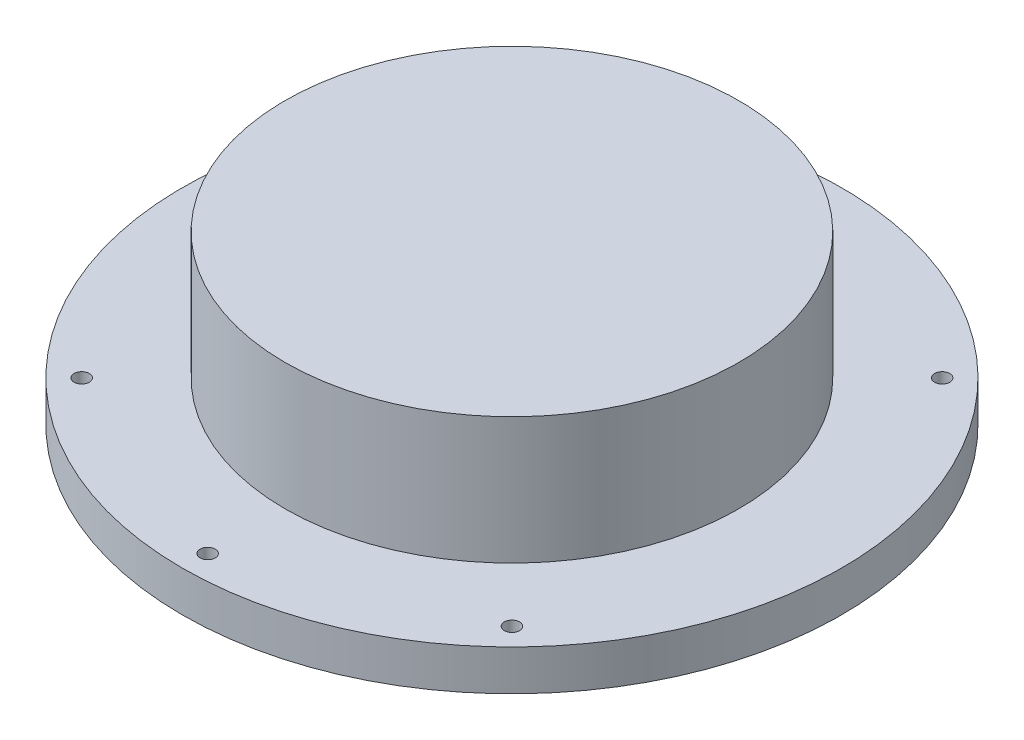
ISO-10303-21;
HEADER;
FILE_DESCRIPTION(('STEP AP214'),'2;1');
FILE_NAME('part.step','',(''),(''),'','','');
FILE_SCHEMA(('AUTOMOTIVE_DESIGN { 1 0 10303 214 1 1 1 1 }'));
ENDSEC;
DATA;
#1=APPLICATION_CONTEXT('core data for automotive mechanical design processes');
#2=APPLICATION_PROTOCOL_DEFINITION('international standard','automotive_design',2000,#1);
#3=PRODUCT_CONTEXT('',#1,'mechanical');
#4=PRODUCT('Part','Part','',(#3));
#5=PRODUCT_RELATED_PRODUCT_CATEGORY('part','',(#4));
#6=PRODUCT_DEFINITION_FORMATION('','',#4);
#7=PRODUCT_DEFINITION_CONTEXT('part definition',#1,'design');
#8=PRODUCT_DEFINITION('design','',#6,#7);
#9=PRODUCT_DEFINITION_SHAPE('','',#8);
#10=(LENGTH_UNIT() NAMED_UNIT(*) SI_UNIT(.MILLI.,.METRE.));
#11=(NAMED_UNIT(*) PLANE_ANGLE_UNIT() SI_UNIT($,.RADIAN.));
#12=(NAMED_UNIT(*) SI_UNIT($,.STERADIAN.) SOLID_ANGLE_UNIT());
#13=UNCERTAINTY_MEASURE_WITH_UNIT(LENGTH_MEASURE(1.E-05),#10,'distance_accuracy_value','');
#14=(GEOMETRIC_REPRESENTATION_CONTEXT(3) GLOBAL_UNCERTAINTY_ASSIGNED_CONTEXT((#13)) GLOBAL_UNIT_ASSIGNED_CONTEXT((#10,
#11,#12)) REPRESENTATION_CONTEXT('',''));
#15=CARTESIAN_POINT('',(0.,0.,0.));
#16=DIRECTION('',(0.,0.,1.));
#17=DIRECTION('',(1.,0.,0.));
#18=AXIS2_PLACEMENT_3D('',#15,#16,#17);
#19=CARTESIAN_POINT('',(0.,8.,0.));
#20=DIRECTION('',(0.,1.,0.));
#21=DIRECTION('',(0.,0.,1.));
#22=AXIS2_PLACEMENT_3D('',#19,#20,#21);
#23=PLANE('',#22);
#24=CARTESIAN_POINT('',(0.,8.,0.));
#25=DIRECTION('',(0.,1.,0.));
#26=DIRECTION('',(0.,0.,1.));
#27=AXIS2_PLACEMENT_3D('',#24,#25,#26);
#28=CIRCLE('',#27,44.7459665379403);
#29=CARTESIAN_POINT('',(0.,8.,44.7459665379403));
#30=VERTEX_POINT('',#29);
#31=EDGE_CURVE('E88',#30,#30,#28,.T.);
#32=ORIENTED_EDGE('',*,*,#31,.F.);
#33=EDGE_LOOP('',(#32));
#34=FACE_BOUND('',#33,.T.);
#35=CARTESIAN_POINT('',(42.4264068711928,8.,-42.4264068711929));
#36=DIRECTION('',(0.,1.,0.));
#37=DIRECTION('',(0.,0.,1.));
#38=AXIS2_PLACEMENT_3D('',#35,#36,#37);
#39=CIRCLE('',#38,1.5);
#40=CARTESIAN_POINT('',(42.4264068711928,8.,-40.9264068711929));
#41=VERTEX_POINT('',#40);
#42=EDGE_CURVE('E73',#41,#41,#39,.T.);
#43=ORIENTED_EDGE('',*,*,#42,.F.);
#44=EDGE_LOOP('',(#43));
#45=FACE_BOUND('',#44,.T.);
#46=CARTESIAN_POINT('',(-42.4264068711929,8.,-42.4264068711928));
#47=DIRECTION('',(0.,1.,0.));
#48=DIRECTION('',(0.,0.,1.));
#49=AXIS2_PLACEMENT_3D('',#46,#47,#48);
#50=CIRCLE('',#49,1.5);
#51=CARTESIAN_POINT('',(-42.4264068711929,8.,-40.9264068711928));
#52=VERTEX_POINT('',#51);
#53=EDGE_CURVE('E61',#52,#52,#50,.T.);
#54=ORIENTED_EDGE('',*,*,#53,.F.);
#55=EDGE_LOOP('',(#54));
#56=FACE_BOUND('',#55,.T.);
#57=CARTESIAN_POINT('',(0.,8.,60.));
#58=DIRECTION('',(0.,1.,0.));
#59=DIRECTION('',(0.,0.,1.));
#60=AXIS2_PLACEMENT_3D('',#57,#58,#59);
#61=CIRCLE('',#60,1.5);
#62=CARTESIAN_POINT('',(0.,8.,61.5));
#63=VERTEX_POINT('',#62);
#64=EDGE_CURVE('E50',#63,#63,#61,.T.);
#65=ORIENTED_EDGE('',*,*,#64,.F.);
#66=EDGE_LOOP('',(#65));
#67=FACE_BOUND('',#66,.T.);
#68=CARTESIAN_POINT('',(0.,8.,0.));
#69=DIRECTION('',(0.,1.,0.));
#70=DIRECTION('',(0.,0.,1.));
#71=AXIS2_PLACEMENT_3D('',#68,#69,#70);
#72=CIRCLE('',#71,65.);
#73=CARTESIAN_POINT('',(0.,8.,65.));
#74=VERTEX_POINT('',#73);
#75=EDGE_CURVE('E10',#74,#74,#72,.T.);
#76=ORIENTED_EDGE('',*,*,#75,.T.);
#77=EDGE_LOOP('',(#76));
#78=FACE_BOUND('',#77,.T.);
#79=CARTESIAN_POINT('',(-42.4264068711929,8.,42.4264068711929));
#80=DIRECTION('',(0.,1.,0.));
#81=DIRECTION('',(0.,0.,1.));
#82=AXIS2_PLACEMENT_3D('',#79,#80,#81);
#83=CIRCLE('',#82,1.5);
#84=CARTESIAN_POINT('',(-42.4264068711929,8.,43.9264068711929));
#85=VERTEX_POINT('',#84);
#86=EDGE_CURVE('E55',#85,#85,#83,.T.);
#87=ORIENTED_EDGE('',*,*,#86,.F.);
#88=EDGE_LOOP('',(#87));
#89=FACE_BOUND('',#88,.T.);
#90=CARTESIAN_POINT('',(0.,8.,-60.));
#91=DIRECTION('',(0.,1.,0.));
#92=DIRECTION('',(0.,0.,1.));
#93=AXIS2_PLACEMENT_3D('',#90,#91,#92);
#94=CIRCLE('',#93,1.5);
#95=CARTESIAN_POINT('',(0.,8.,-58.5));
#96=VERTEX_POINT('',#95);
#97=EDGE_CURVE('E67',#96,#96,#94,.T.);
#98=ORIENTED_EDGE('',*,*,#97,.F.);
#99=EDGE_LOOP('',(#98));
#100=FACE_BOUND('',#99,.T.);
#101=CARTESIAN_POINT('',(42.4264068711929,8.,42.4264068711929));
#102=DIRECTION('',(0.,1.,0.));
#103=DIRECTION('',(0.,0.,1.));
#104=AXIS2_PLACEMENT_3D('',#101,#102,#103);
#105=CIRCLE('',#104,1.5);
#106=CARTESIAN_POINT('',(42.4264068711929,8.,43.9264068711929));
#107=VERTEX_POINT('',#106);
#108=EDGE_CURVE('E79',#107,#107,#105,.T.);
#109=ORIENTED_EDGE('',*,*,#108,.F.);
#110=EDGE_LOOP('',(#109));
#111=FACE_BOUND('',#110,.T.);
#112=ADVANCED_FACE('F39',(#34,#45,#56,#67,#78,#89,#100,#111),#23,.T.);
#113=CARTESIAN_POINT('',(0.,0.,0.));
#114=DIRECTION('',(0.,1.,0.));
#115=DIRECTION('',(0.,0.,1.));
#116=AXIS2_PLACEMENT_3D('',#113,#114,#115);
#117=PLANE('',#116);
#118=CARTESIAN_POINT('',(0.,0.,0.));
#119=DIRECTION('',(0.,1.,0.));
#120=DIRECTION('',(0.,0.,1.));
#121=AXIS2_PLACEMENT_3D('',#118,#119,#120);
#122=CIRCLE('',#121,65.);
#123=CARTESIAN_POINT('',(0.,0.,65.));
#124=VERTEX_POINT('',#123);
#125=EDGE_CURVE('E43',#124,#124,#122,.T.);
#126=ORIENTED_EDGE('',*,*,#125,.F.);
#127=EDGE_LOOP('',(#126));
#128=FACE_BOUND('',#127,.T.);
#129=CARTESIAN_POINT('',(0.,0.,60.));
#130=DIRECTION('',(0.,1.,0.));
#131=DIRECTION('',(0.,0.,1.));
#132=AXIS2_PLACEMENT_3D('',#129,#130,#131);
#133=CIRCLE('',#132,1.5);
#134=CARTESIAN_POINT('',(0.,0.,61.5));
#135=VERTEX_POINT('',#134);
#136=EDGE_CURVE('E52',#135,#135,#133,.T.);
#137=ORIENTED_EDGE('',*,*,#136,.T.);
#138=EDGE_LOOP('',(#137));
#139=FACE_BOUND('',#138,.T.);
#140=CARTESIAN_POINT('',(-42.4264068711929,0.,42.4264068711929));
#141=DIRECTION('',(0.,1.,0.));
#142=DIRECTION('',(0.,0.,1.));
#143=AXIS2_PLACEMENT_3D('',#140,#141,#142);
#144=CIRCLE('',#143,1.5);
#145=CARTESIAN_POINT('',(-42.4264068711929,0.,43.9264068711929));
#146=VERTEX_POINT('',#145);
#147=EDGE_CURVE('E58',#146,#146,#144,.T.);
#148=ORIENTED_EDGE('',*,*,#147,.T.);
#149=EDGE_LOOP('',(#148));
#150=FACE_BOUND('',#149,.T.);
#151=CARTESIAN_POINT('',(-42.4264068711929,0.,-42.4264068711928));
#152=DIRECTION('',(0.,1.,0.));
#153=DIRECTION('',(0.,0.,1.));
#154=AXIS2_PLACEMENT_3D('',#151,#152,#153);
#155=CIRCLE('',#154,1.5);
#156=CARTESIAN_POINT('',(-42.4264068711929,0.,-40.9264068711928));
#157=VERTEX_POINT('',#156);
#158=EDGE_CURVE('E64',#157,#157,#155,.T.);
#159=ORIENTED_EDGE('',*,*,#158,.T.);
#160=EDGE_LOOP('',(#159));
#161=FACE_BOUND('',#160,.T.);
#162=CARTESIAN_POINT('',(0.,0.,-60.));
#163=DIRECTION('',(0.,1.,0.));
#164=DIRECTION('',(0.,0.,1.));
#165=AXIS2_PLACEMENT_3D('',#162,#163,#164);
#166=CIRCLE('',#165,1.5);
#167=CARTESIAN_POINT('',(0.,0.,-58.5));
#168=VERTEX_POINT('',#167);
#169=EDGE_CURVE('E70',#168,#168,#166,.T.);
#170=ORIENTED_EDGE('',*,*,#169,.T.);
#171=EDGE_LOOP('',(#170));
#172=FACE_BOUND('',#171,.T.);
#173=CARTESIAN_POINT('',(42.4264068711928,0.,-42.4264068711929));
#174=DIRECTION('',(0.,1.,0.));
#175=DIRECTION('',(0.,0.,1.));
#176=AXIS2_PLACEMENT_3D('',#173,#174,#175);
#177=CIRCLE('',#176,1.5);
#178=CARTESIAN_POINT('',(42.4264068711928,0.,-40.9264068711929));
#179=VERTEX_POINT('',#178);
#180=EDGE_CURVE('E76',#179,#179,#177,.T.);
#181=ORIENTED_EDGE('',*,*,#180,.T.);
#182=EDGE_LOOP('',(#181));
#183=FACE_BOUND('',#182,.T.);
#184=CARTESIAN_POINT('',(42.4264068711929,0.,42.4264068711929));
#185=DIRECTION('',(0.,1.,0.));
#186=DIRECTION('',(0.,0.,1.));
#187=AXIS2_PLACEMENT_3D('',#184,#185,#186);
#188=CIRCLE('',#187,1.5);
#189=CARTESIAN_POINT('',(42.4264068711929,0.,43.9264068711929));
#190=VERTEX_POINT('',#189);
#191=EDGE_CURVE('E82',#190,#190,#188,.T.);
#192=ORIENTED_EDGE('',*,*,#191,.T.);
#193=EDGE_LOOP('',(#192));
#194=FACE_BOUND('',#193,.T.);
#195=ADVANCED_FACE('F105',(#128,#139,#150,#161,#172,#183,#194),#117,.F.);
#196=CARTESIAN_POINT('',(0.,8.,0.));
#197=DIRECTION('',(0.,-1.,0.));
#198=DIRECTION('',(0.,0.,-1.));
#199=AXIS2_PLACEMENT_3D('',#196,#197,#198);
#200=CYLINDRICAL_SURFACE('',#199,65.);
#201=ORIENTED_EDGE('',*,*,#75,.F.);
#202=EDGE_LOOP('',(#201));
#203=FACE_BOUND('',#202,.T.);
#204=ORIENTED_EDGE('',*,*,#125,.T.);
#205=EDGE_LOOP('',(#204));
#206=FACE_BOUND('',#205,.T.);
#207=ADVANCED_FACE('F41',(#203,#206),#200,.T.);
#208=CARTESIAN_POINT('',(0.,8.,60.));
#209=DIRECTION('',(0.,-1.,0.));
#210=DIRECTION('',(0.,0.,-1.));
#211=AXIS2_PLACEMENT_3D('',#208,#209,#210);
#212=CYLINDRICAL_SURFACE('',#211,1.5);
#213=ORIENTED_EDGE('',*,*,#64,.T.);
#214=EDGE_LOOP('',(#213));
#215=FACE_BOUND('',#214,.T.);
#216=ORIENTED_EDGE('',*,*,#136,.F.);
#217=EDGE_LOOP('',(#216));
#218=FACE_BOUND('',#217,.T.);
#219=ADVANCED_FACE('F131',(#215,#218),#212,.F.);
#220=CARTESIAN_POINT('',(-42.4264068711929,8.,42.4264068711929));
#221=DIRECTION('',(0.,-1.,0.));
#222=DIRECTION('',(0.,0.,-1.));
#223=AXIS2_PLACEMENT_3D('',#220,#221,#222);
#224=CYLINDRICAL_SURFACE('',#223,1.5);
#225=ORIENTED_EDGE('',*,*,#86,.T.);
#226=EDGE_LOOP('',(#225));
#227=FACE_BOUND('',#226,.T.);
#228=ORIENTED_EDGE('',*,*,#147,.F.);
#229=EDGE_LOOP('',(#228));
#230=FACE_BOUND('',#229,.T.);
#231=ADVANCED_FACE('F138',(#227,#230),#224,.F.);
#232=CARTESIAN_POINT('',(-42.4264068711929,8.,-42.4264068711928));
#233=DIRECTION('',(0.,-1.,0.));
#234=DIRECTION('',(0.,0.,-1.));
#235=AXIS2_PLACEMENT_3D('',#232,#233,#234);
#236=CYLINDRICAL_SURFACE('',#235,1.5);
#237=ORIENTED_EDGE('',*,*,#53,.T.);
#238=EDGE_LOOP('',(#237));
#239=FACE_BOUND('',#238,.T.);
#240=ORIENTED_EDGE('',*,*,#158,.F.);
#241=EDGE_LOOP('',(#240));
#242=FACE_BOUND('',#241,.T.);
#243=ADVANCED_FACE('F142',(#239,#242),#236,.F.);
#244=CARTESIAN_POINT('',(0.,8.,-60.));
#245=DIRECTION('',(0.,-1.,0.));
#246=DIRECTION('',(0.,0.,-1.));
#247=AXIS2_PLACEMENT_3D('',#244,#245,#246);
#248=CYLINDRICAL_SURFACE('',#247,1.5);
#249=ORIENTED_EDGE('',*,*,#97,.T.);
#250=EDGE_LOOP('',(#249));
#251=FACE_BOUND('',#250,.T.);
#252=ORIENTED_EDGE('',*,*,#169,.F.);
#253=EDGE_LOOP('',(#252));
#254=FACE_BOUND('',#253,.T.);
#255=ADVANCED_FACE('F146',(#251,#254),#248,.F.);
#256=CARTESIAN_POINT('',(42.4264068711928,8.,-42.4264068711929));
#257=DIRECTION('',(0.,-1.,0.));
#258=DIRECTION('',(0.,0.,-1.));
#259=AXIS2_PLACEMENT_3D('',#256,#257,#258);
#260=CYLINDRICAL_SURFACE('',#259,1.5);
#261=ORIENTED_EDGE('',*,*,#42,.T.);
#262=EDGE_LOOP('',(#261));
#263=FACE_BOUND('',#262,.T.);
#264=ORIENTED_EDGE('',*,*,#180,.F.);
#265=EDGE_LOOP('',(#264));
#266=FACE_BOUND('',#265,.T.);
#267=ADVANCED_FACE('F121',(#263,#266),#260,.F.);
#268=CARTESIAN_POINT('',(42.4264068711929,8.,42.4264068711929));
#269=DIRECTION('',(0.,-1.,0.));
#270=DIRECTION('',(0.,0.,-1.));
#271=AXIS2_PLACEMENT_3D('',#268,#269,#270);
#272=CYLINDRICAL_SURFACE('',#271,1.5);
#273=ORIENTED_EDGE('',*,*,#108,.T.);
#274=EDGE_LOOP('',(#273));
#275=FACE_BOUND('',#274,.T.);
#276=ORIENTED_EDGE('',*,*,#191,.F.);
#277=EDGE_LOOP('',(#276));
#278=FACE_BOUND('',#277,.T.);
#279=ADVANCED_FACE('F99',(#275,#278),#272,.F.);
#280=CARTESIAN_POINT('',(0.,33.,0.));
#281=DIRECTION('',(0.,-1.,0.));
#282=DIRECTION('',(0.,0.,-1.));
#283=AXIS2_PLACEMENT_3D('',#280,#281,#282);
#284=CYLINDRICAL_SURFACE('',#283,44.7459665379403);
#285=CARTESIAN_POINT('',(0.,33.,0.));
#286=DIRECTION('',(0.,1.,0.));
#287=DIRECTION('',(0.,0.,1.));
#288=AXIS2_PLACEMENT_3D('',#285,#286,#287);
#289=CIRCLE('',#288,44.7459665379403);
#290=CARTESIAN_POINT('',(0.,33.,44.7459665379403));
#291=VERTEX_POINT('',#290);
#292=EDGE_CURVE('E85',#291,#291,#289,.T.);
#293=ORIENTED_EDGE('',*,*,#292,.F.);
#294=EDGE_LOOP('',(#293));
#295=FACE_BOUND('',#294,.T.);
#296=ORIENTED_EDGE('',*,*,#31,.T.);
#297=EDGE_LOOP('',(#296));
#298=FACE_BOUND('',#297,.T.);
#299=ADVANCED_FACE('F96',(#295,#298),#284,.T.);
#300=CARTESIAN_POINT('',(0.,33.,0.));
#301=DIRECTION('',(0.,1.,0.));
#302=DIRECTION('',(0.,0.,1.));
#303=AXIS2_PLACEMENT_3D('',#300,#301,#302);
#304=PLANE('',#303);
#305=ORIENTED_EDGE('',*,*,#292,.T.);
#306=EDGE_LOOP('',(#305));
#307=FACE_BOUND('',#306,.T.);
#308=ADVANCED_FACE('F94',(#307),#304,.T.);
#309=CLOSED_SHELL('',(#112,#195,#207,#219,#231,#243,#255,#267,#279,#299,#308));
#310=MANIFOLD_SOLID_BREP('B2',#309);
#311=ADVANCED_BREP_SHAPE_REPRESENTATION('',(#18,#310),#14);
#312=SHAPE_DEFINITION_REPRESENTATION(#9,#311);
ENDSEC;
END-ISO-10303-21;
